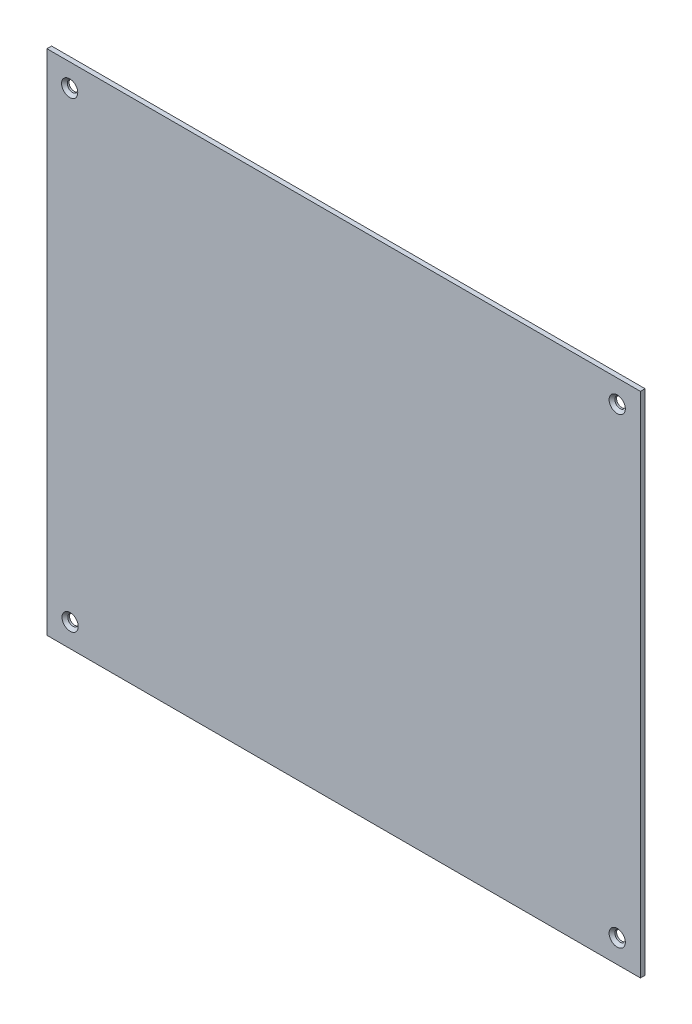
ISO-10303-21;
HEADER;
FILE_DESCRIPTION(('STEP AP214'),'2;1');
FILE_NAME('part.step','',(''),(''),'','','');
FILE_SCHEMA(('AUTOMOTIVE_DESIGN { 1 0 10303 214 1 1 1 1 }'));
ENDSEC;
DATA;
#1=APPLICATION_CONTEXT('core data for automotive mechanical design processes');
#2=APPLICATION_PROTOCOL_DEFINITION('international standard','automotive_design',2000,#1);
#3=PRODUCT_CONTEXT('',#1,'mechanical');
#4=PRODUCT('Part','Part','',(#3));
#5=PRODUCT_RELATED_PRODUCT_CATEGORY('part','',(#4));
#6=PRODUCT_DEFINITION_FORMATION('','',#4);
#7=PRODUCT_DEFINITION_CONTEXT('part definition',#1,'design');
#8=PRODUCT_DEFINITION('design','',#6,#7);
#9=PRODUCT_DEFINITION_SHAPE('','',#8);
#10=(LENGTH_UNIT() NAMED_UNIT(*) SI_UNIT(.MILLI.,.METRE.));
#11=(NAMED_UNIT(*) PLANE_ANGLE_UNIT() SI_UNIT($,.RADIAN.));
#12=(NAMED_UNIT(*) SI_UNIT($,.STERADIAN.) SOLID_ANGLE_UNIT());
#13=UNCERTAINTY_MEASURE_WITH_UNIT(LENGTH_MEASURE(1.E-05),#10,'distance_accuracy_value','');
#14=(GEOMETRIC_REPRESENTATION_CONTEXT(3) GLOBAL_UNCERTAINTY_ASSIGNED_CONTEXT((#13)) GLOBAL_UNIT_ASSIGNED_CONTEXT((#10,
#11,#12)) REPRESENTATION_CONTEXT('',''));
#15=CARTESIAN_POINT('',(0.,0.,0.));
#16=DIRECTION('',(0.,0.,1.));
#17=DIRECTION('',(1.,0.,0.));
#18=AXIS2_PLACEMENT_3D('',#15,#16,#17);
#19=CARTESIAN_POINT('',(0.,0.,1.905));
#20=DIRECTION('',(0.,0.,-1.));
#21=DIRECTION('',(-1.,0.,0.));
#22=AXIS2_PLACEMENT_3D('',#19,#20,#21);
#23=PLANE('',#22);
#24=CARTESIAN_POINT('',(233.807,9.525,1.905));
#25=DIRECTION('',(0.,0.,1.));
#26=DIRECTION('',(1.,0.,0.));
#27=AXIS2_PLACEMENT_3D('',#24,#25,#26);
#28=CIRCLE('',#27,3.32740000000001);
#29=CARTESIAN_POINT('',(237.1344,9.525,1.905));
#30=VERTEX_POINT('',#29);
#31=EDGE_CURVE('E139',#30,#30,#28,.T.);
#32=ORIENTED_EDGE('',*,*,#31,.F.);
#33=EDGE_LOOP('',(#32));
#34=FACE_BOUND('',#33,.T.);
#35=CARTESIAN_POINT('',(233.807,198.955000999999,1.905));
#36=DIRECTION('',(0.,0.,1.));
#37=DIRECTION('',(1.,0.,0.));
#38=AXIS2_PLACEMENT_3D('',#35,#36,#37);
#39=CIRCLE('',#38,3.32740000000001);
#40=CARTESIAN_POINT('',(237.1344,198.955000999999,1.905));
#41=VERTEX_POINT('',#40);
#42=EDGE_CURVE('E121',#41,#41,#39,.T.);
#43=ORIENTED_EDGE('',*,*,#42,.F.);
#44=EDGE_LOOP('',(#43));
#45=FACE_BOUND('',#44,.T.);
#46=DIRECTION('',(0.,-1.,0.));
#47=VECTOR('',#46,1.);
#48=CARTESIAN_POINT('',(0.,0.,1.905));
#49=LINE('',#48,#47);
#50=CARTESIAN_POINT('',(0.,208.28,1.905));
#51=VERTEX_POINT('',#50);
#52=CARTESIAN_POINT('',(0.,0.,1.905));
#53=VERTEX_POINT('',#52);
#54=EDGE_CURVE('E90',#51,#53,#49,.T.);
#55=ORIENTED_EDGE('',*,*,#54,.T.);
#56=DIRECTION('',(1.,0.,0.));
#57=VECTOR('',#56,1.);
#58=CARTESIAN_POINT('',(0.,0.,1.905));
#59=LINE('',#58,#57);
#60=CARTESIAN_POINT('',(243.332,0.,1.905));
#61=VERTEX_POINT('',#60);
#62=EDGE_CURVE('E85',#53,#61,#59,.T.);
#63=ORIENTED_EDGE('',*,*,#62,.T.);
#64=DIRECTION('',(0.,1.,0.));
#65=VECTOR('',#64,1.);
#66=CARTESIAN_POINT('',(243.332,0.,1.905));
#67=LINE('',#66,#65);
#68=CARTESIAN_POINT('',(243.332,208.28,1.905));
#69=VERTEX_POINT('',#68);
#70=EDGE_CURVE('E88',#61,#69,#67,.T.);
#71=ORIENTED_EDGE('',*,*,#70,.T.);
#72=DIRECTION('',(-1.,0.,0.));
#73=VECTOR('',#72,1.);
#74=CARTESIAN_POINT('',(0.,208.28,1.905));
#75=LINE('',#74,#73);
#76=EDGE_CURVE('E55',#69,#51,#75,.T.);
#77=ORIENTED_EDGE('',*,*,#76,.T.);
#78=EDGE_LOOP('',(#55,#63,#71,#77));
#79=FACE_BOUND('',#78,.T.);
#80=CARTESIAN_POINT('',(9.525,9.525,1.905));
#81=DIRECTION('',(0.,0.,1.));
#82=DIRECTION('',(1.,0.,0.));
#83=AXIS2_PLACEMENT_3D('',#80,#81,#82);
#84=CIRCLE('',#83,3.3274);
#85=CARTESIAN_POINT('',(12.8524,9.525,1.905));
#86=VERTEX_POINT('',#85);
#87=EDGE_CURVE('E130',#86,#86,#84,.T.);
#88=ORIENTED_EDGE('',*,*,#87,.F.);
#89=EDGE_LOOP('',(#88));
#90=FACE_BOUND('',#89,.T.);
#91=CARTESIAN_POINT('',(9.32499900000117,198.955000999999,1.905));
#92=DIRECTION('',(0.,0.,1.));
#93=DIRECTION('',(1.,0.,0.));
#94=AXIS2_PLACEMENT_3D('',#91,#92,#93);
#95=CIRCLE('',#94,3.3274);
#96=CARTESIAN_POINT('',(12.6523990000012,198.955000999999,1.905));
#97=VERTEX_POINT('',#96);
#98=EDGE_CURVE('E148',#97,#97,#95,.T.);
#99=ORIENTED_EDGE('',*,*,#98,.F.);
#100=EDGE_LOOP('',(#99));
#101=FACE_BOUND('',#100,.T.);
#102=ADVANCED_FACE('F38',(#34,#45,#79,#90,#101),#23,.F.);
#103=CARTESIAN_POINT('',(0.,0.,1.905));
#104=DIRECTION('',(1.,0.,0.));
#105=DIRECTION('',(0.,0.,-1.));
#106=AXIS2_PLACEMENT_3D('',#103,#104,#105);
#107=PLANE('',#106);
#108=DIRECTION('',(0.,-1.,0.));
#109=VECTOR('',#108,1.);
#110=CARTESIAN_POINT('',(0.,0.,0.));
#111=LINE('',#110,#109);
#112=CARTESIAN_POINT('',(0.,208.28,0.));
#113=VERTEX_POINT('',#112);
#114=CARTESIAN_POINT('',(0.,0.,0.));
#115=VERTEX_POINT('',#114);
#116=EDGE_CURVE('E102',#113,#115,#111,.T.);
#117=ORIENTED_EDGE('',*,*,#116,.T.);
#118=DIRECTION('',(0.,0.,-1.));
#119=VECTOR('',#118,1.);
#120=CARTESIAN_POINT('',(0.,0.,1.905));
#121=LINE('',#120,#119);
#122=EDGE_CURVE('E11',#53,#115,#121,.T.);
#123=ORIENTED_EDGE('',*,*,#122,.F.);
#124=ORIENTED_EDGE('',*,*,#54,.F.);
#125=DIRECTION('',(0.,0.,-1.));
#126=VECTOR('',#125,1.);
#127=CARTESIAN_POINT('',(0.,208.28,1.905));
#128=LINE('',#127,#126);
#129=EDGE_CURVE('E98',#51,#113,#128,.T.);
#130=ORIENTED_EDGE('',*,*,#129,.T.);
#131=EDGE_LOOP('',(#117,#123,#124,#130));
#132=FACE_BOUND('',#131,.T.);
#133=ADVANCED_FACE('F40',(#132),#107,.F.);
#134=CARTESIAN_POINT('',(0.,0.,1.905));
#135=DIRECTION('',(0.,1.,0.));
#136=DIRECTION('',(0.,0.,1.));
#137=AXIS2_PLACEMENT_3D('',#134,#135,#136);
#138=PLANE('',#137);
#139=DIRECTION('',(1.,0.,0.));
#140=VECTOR('',#139,1.);
#141=CARTESIAN_POINT('',(0.,0.,0.));
#142=LINE('',#141,#140);
#143=CARTESIAN_POINT('',(243.332,0.,0.));
#144=VERTEX_POINT('',#143);
#145=EDGE_CURVE('E94',#115,#144,#142,.T.);
#146=ORIENTED_EDGE('',*,*,#145,.T.);
#147=DIRECTION('',(0.,0.,-1.));
#148=VECTOR('',#147,1.);
#149=CARTESIAN_POINT('',(243.332,0.,1.905));
#150=LINE('',#149,#148);
#151=EDGE_CURVE('E47',#61,#144,#150,.T.);
#152=ORIENTED_EDGE('',*,*,#151,.F.);
#153=ORIENTED_EDGE('',*,*,#62,.F.);
#154=ORIENTED_EDGE('',*,*,#122,.T.);
#155=EDGE_LOOP('',(#146,#152,#153,#154));
#156=FACE_BOUND('',#155,.T.);
#157=ADVANCED_FACE('F93',(#156),#138,.F.);
#158=CARTESIAN_POINT('',(243.332,0.,1.905));
#159=DIRECTION('',(-1.,0.,0.));
#160=DIRECTION('',(0.,0.,1.));
#161=AXIS2_PLACEMENT_3D('',#158,#159,#160);
#162=PLANE('',#161);
#163=DIRECTION('',(0.,1.,0.));
#164=VECTOR('',#163,1.);
#165=CARTESIAN_POINT('',(243.332,0.,0.));
#166=LINE('',#165,#164);
#167=CARTESIAN_POINT('',(243.332,208.28,0.));
#168=VERTEX_POINT('',#167);
#169=EDGE_CURVE('E72',#144,#168,#166,.T.);
#170=ORIENTED_EDGE('',*,*,#169,.T.);
#171=DIRECTION('',(0.,0.,-1.));
#172=VECTOR('',#171,1.);
#173=CARTESIAN_POINT('',(243.332,208.28,1.905));
#174=LINE('',#173,#172);
#175=EDGE_CURVE('E95',#69,#168,#174,.T.);
#176=ORIENTED_EDGE('',*,*,#175,.F.);
#177=ORIENTED_EDGE('',*,*,#70,.F.);
#178=ORIENTED_EDGE('',*,*,#151,.T.);
#179=EDGE_LOOP('',(#170,#176,#177,#178));
#180=FACE_BOUND('',#179,.T.);
#181=ADVANCED_FACE('F96',(#180),#162,.F.);
#182=CARTESIAN_POINT('',(0.,208.28,1.905));
#183=DIRECTION('',(0.,-1.,0.));
#184=DIRECTION('',(0.,0.,-1.));
#185=AXIS2_PLACEMENT_3D('',#182,#183,#184);
#186=PLANE('',#185);
#187=DIRECTION('',(-1.,0.,0.));
#188=VECTOR('',#187,1.);
#189=CARTESIAN_POINT('',(0.,208.28,0.));
#190=LINE('',#189,#188);
#191=EDGE_CURVE('E78',#168,#113,#190,.T.);
#192=ORIENTED_EDGE('',*,*,#191,.T.);
#193=ORIENTED_EDGE('',*,*,#129,.F.);
#194=ORIENTED_EDGE('',*,*,#76,.F.);
#195=ORIENTED_EDGE('',*,*,#175,.T.);
#196=EDGE_LOOP('',(#192,#193,#194,#195));
#197=FACE_BOUND('',#196,.T.);
#198=ADVANCED_FACE('F110',(#197),#186,.F.);
#199=CARTESIAN_POINT('',(0.,0.,0.));
#200=DIRECTION('',(0.,0.,-1.));
#201=DIRECTION('',(-1.,0.,0.));
#202=AXIS2_PLACEMENT_3D('',#199,#200,#201);
#203=PLANE('',#202);
#204=CARTESIAN_POINT('',(9.32499900000117,198.955000999999,0.));
#205=DIRECTION('',(0.,0.,-1.));
#206=DIRECTION('',(-1.,0.,0.));
#207=AXIS2_PLACEMENT_3D('',#204,#205,#206);
#208=CIRCLE('',#207,2.15265);
#209=CARTESIAN_POINT('',(7.17234900000117,198.955000999999,0.));
#210=VERTEX_POINT('',#209);
#211=EDGE_CURVE('E142',#210,#210,#208,.T.);
#212=ORIENTED_EDGE('',*,*,#211,.F.);
#213=EDGE_LOOP('',(#212));
#214=FACE_BOUND('',#213,.T.);
#215=CARTESIAN_POINT('',(233.807,9.525,0.));
#216=DIRECTION('',(0.,0.,-1.));
#217=DIRECTION('',(-1.,0.,0.));
#218=AXIS2_PLACEMENT_3D('',#215,#216,#217);
#219=CIRCLE('',#218,2.15265000000001);
#220=CARTESIAN_POINT('',(231.65435,9.525,0.));
#221=VERTEX_POINT('',#220);
#222=EDGE_CURVE('E133',#221,#221,#219,.T.);
#223=ORIENTED_EDGE('',*,*,#222,.F.);
#224=EDGE_LOOP('',(#223));
#225=FACE_BOUND('',#224,.T.);
#226=CARTESIAN_POINT('',(9.525,9.525,0.));
#227=DIRECTION('',(0.,0.,-1.));
#228=DIRECTION('',(-1.,0.,0.));
#229=AXIS2_PLACEMENT_3D('',#226,#227,#228);
#230=CIRCLE('',#229,2.15265);
#231=CARTESIAN_POINT('',(7.37235,9.525,0.));
#232=VERTEX_POINT('',#231);
#233=EDGE_CURVE('E124',#232,#232,#230,.T.);
#234=ORIENTED_EDGE('',*,*,#233,.F.);
#235=EDGE_LOOP('',(#234));
#236=FACE_BOUND('',#235,.T.);
#237=CARTESIAN_POINT('',(233.807,198.955000999999,0.));
#238=DIRECTION('',(0.,0.,-1.));
#239=DIRECTION('',(-1.,0.,0.));
#240=AXIS2_PLACEMENT_3D('',#237,#238,#239);
#241=CIRCLE('',#240,2.15265000000001);
#242=CARTESIAN_POINT('',(231.65435,198.955000999999,0.));
#243=VERTEX_POINT('',#242);
#244=EDGE_CURVE('E105',#243,#243,#241,.T.);
#245=ORIENTED_EDGE('',*,*,#244,.F.);
#246=EDGE_LOOP('',(#245));
#247=FACE_BOUND('',#246,.T.);
#248=ORIENTED_EDGE('',*,*,#116,.F.);
#249=ORIENTED_EDGE('',*,*,#191,.F.);
#250=ORIENTED_EDGE('',*,*,#169,.F.);
#251=ORIENTED_EDGE('',*,*,#145,.F.);
#252=EDGE_LOOP('',(#248,#249,#250,#251));
#253=FACE_BOUND('',#252,.T.);
#254=ADVANCED_FACE('F113',(#214,#225,#236,#247,#253),#203,.T.);
#255=CARTESIAN_POINT('',(233.807,198.955000999999,1.905));
#256=DIRECTION('',(0.,0.,1.));
#257=DIRECTION('',(1.,0.,0.));
#258=AXIS2_PLACEMENT_3D('',#255,#256,#257);
#259=CYLINDRICAL_SURFACE('',#258,2.15265000000001);
#260=CARTESIAN_POINT('',(233.807,198.955000999999,0.73025));
#261=DIRECTION('',(0.,0.,1.));
#262=DIRECTION('',(1.,0.,0.));
#263=AXIS2_PLACEMENT_3D('',#260,#261,#262);
#264=CIRCLE('',#263,2.15265000000001);
#265=CARTESIAN_POINT('',(235.95965,198.955000999999,0.73025));
#266=VERTEX_POINT('',#265);
#267=EDGE_CURVE('E118',#266,#266,#264,.T.);
#268=ORIENTED_EDGE('',*,*,#267,.T.);
#269=EDGE_LOOP('',(#268));
#270=FACE_BOUND('',#269,.T.);
#271=ORIENTED_EDGE('',*,*,#244,.T.);
#272=EDGE_LOOP('',(#271));
#273=FACE_BOUND('',#272,.T.);
#274=ADVANCED_FACE('F166',(#270,#273),#259,.F.);
#275=CARTESIAN_POINT('',(233.807,198.955000999999,1.905));
#276=DIRECTION('',(0.,0.,1.));
#277=DIRECTION('',(1.,0.,0.));
#278=AXIS2_PLACEMENT_3D('',#275,#276,#277);
#279=CONICAL_SURFACE('',#278,3.32740000000001,0.785398163397449);
#280=ORIENTED_EDGE('',*,*,#267,.F.);
#281=EDGE_LOOP('',(#280));
#282=FACE_BOUND('',#281,.T.);
#283=ORIENTED_EDGE('',*,*,#42,.T.);
#284=EDGE_LOOP('',(#283));
#285=FACE_BOUND('',#284,.T.);
#286=ADVANCED_FACE('F207',(#282,#285),#279,.F.);
#287=CARTESIAN_POINT('',(9.525,9.525,1.905));
#288=DIRECTION('',(0.,0.,1.));
#289=DIRECTION('',(1.,0.,0.));
#290=AXIS2_PLACEMENT_3D('',#287,#288,#289);
#291=CYLINDRICAL_SURFACE('',#290,2.15265);
#292=CARTESIAN_POINT('',(9.525,9.525,0.73025));
#293=DIRECTION('',(0.,0.,1.));
#294=DIRECTION('',(1.,0.,0.));
#295=AXIS2_PLACEMENT_3D('',#292,#293,#294);
#296=CIRCLE('',#295,2.15265);
#297=CARTESIAN_POINT('',(11.67765,9.525,0.73025));
#298=VERTEX_POINT('',#297);
#299=EDGE_CURVE('E127',#298,#298,#296,.T.);
#300=ORIENTED_EDGE('',*,*,#299,.T.);
#301=EDGE_LOOP('',(#300));
#302=FACE_BOUND('',#301,.T.);
#303=ORIENTED_EDGE('',*,*,#233,.T.);
#304=EDGE_LOOP('',(#303));
#305=FACE_BOUND('',#304,.T.);
#306=ADVANCED_FACE('F216',(#302,#305),#291,.F.);
#307=CARTESIAN_POINT('',(9.525,9.525,1.905));
#308=DIRECTION('',(0.,0.,1.));
#309=DIRECTION('',(1.,0.,0.));
#310=AXIS2_PLACEMENT_3D('',#307,#308,#309);
#311=CONICAL_SURFACE('',#310,3.3274,0.785398163397448);
#312=ORIENTED_EDGE('',*,*,#299,.F.);
#313=EDGE_LOOP('',(#312));
#314=FACE_BOUND('',#313,.T.);
#315=ORIENTED_EDGE('',*,*,#87,.T.);
#316=EDGE_LOOP('',(#315));
#317=FACE_BOUND('',#316,.T.);
#318=ADVANCED_FACE('F225',(#314,#317),#311,.F.);
#319=CARTESIAN_POINT('',(233.807,9.525,1.905));
#320=DIRECTION('',(0.,0.,1.));
#321=DIRECTION('',(1.,0.,0.));
#322=AXIS2_PLACEMENT_3D('',#319,#320,#321);
#323=CYLINDRICAL_SURFACE('',#322,2.15265000000001);
#324=CARTESIAN_POINT('',(233.807,9.525,0.73025));
#325=DIRECTION('',(0.,0.,1.));
#326=DIRECTION('',(1.,0.,0.));
#327=AXIS2_PLACEMENT_3D('',#324,#325,#326);
#328=CIRCLE('',#327,2.15265000000001);
#329=CARTESIAN_POINT('',(235.95965,9.525,0.73025));
#330=VERTEX_POINT('',#329);
#331=EDGE_CURVE('E136',#330,#330,#328,.T.);
#332=ORIENTED_EDGE('',*,*,#331,.T.);
#333=EDGE_LOOP('',(#332));
#334=FACE_BOUND('',#333,.T.);
#335=ORIENTED_EDGE('',*,*,#222,.T.);
#336=EDGE_LOOP('',(#335));
#337=FACE_BOUND('',#336,.T.);
#338=ADVANCED_FACE('F235',(#334,#337),#323,.F.);
#339=CARTESIAN_POINT('',(233.807,9.525,1.905));
#340=DIRECTION('',(0.,0.,1.));
#341=DIRECTION('',(1.,0.,0.));
#342=AXIS2_PLACEMENT_3D('',#339,#340,#341);
#343=CONICAL_SURFACE('',#342,3.32740000000001,0.785398163397449);
#344=ORIENTED_EDGE('',*,*,#331,.F.);
#345=EDGE_LOOP('',(#344));
#346=FACE_BOUND('',#345,.T.);
#347=ORIENTED_EDGE('',*,*,#31,.T.);
#348=EDGE_LOOP('',(#347));
#349=FACE_BOUND('',#348,.T.);
#350=ADVANCED_FACE('F245',(#346,#349),#343,.F.);
#351=CARTESIAN_POINT('',(9.32499900000117,198.955000999999,1.905));
#352=DIRECTION('',(0.,0.,1.));
#353=DIRECTION('',(1.,0.,0.));
#354=AXIS2_PLACEMENT_3D('',#351,#352,#353);
#355=CYLINDRICAL_SURFACE('',#354,2.15265);
#356=CARTESIAN_POINT('',(9.32499900000117,198.955000999999,0.73025));
#357=DIRECTION('',(0.,0.,1.));
#358=DIRECTION('',(1.,0.,0.));
#359=AXIS2_PLACEMENT_3D('',#356,#357,#358);
#360=CIRCLE('',#359,2.15265);
#361=CARTESIAN_POINT('',(11.4776490000012,198.955000999999,0.73025));
#362=VERTEX_POINT('',#361);
#363=EDGE_CURVE('E145',#362,#362,#360,.T.);
#364=ORIENTED_EDGE('',*,*,#363,.T.);
#365=EDGE_LOOP('',(#364));
#366=FACE_BOUND('',#365,.T.);
#367=ORIENTED_EDGE('',*,*,#211,.T.);
#368=EDGE_LOOP('',(#367));
#369=FACE_BOUND('',#368,.T.);
#370=ADVANCED_FACE('F255',(#366,#369),#355,.F.);
#371=CARTESIAN_POINT('',(9.32499900000117,198.955000999999,1.905));
#372=DIRECTION('',(0.,0.,1.));
#373=DIRECTION('',(1.,0.,0.));
#374=AXIS2_PLACEMENT_3D('',#371,#372,#373);
#375=CONICAL_SURFACE('',#374,3.3274,0.785398163397448);
#376=ORIENTED_EDGE('',*,*,#363,.F.);
#377=EDGE_LOOP('',(#376));
#378=FACE_BOUND('',#377,.T.);
#379=ORIENTED_EDGE('',*,*,#98,.T.);
#380=EDGE_LOOP('',(#379));
#381=FACE_BOUND('',#380,.T.);
#382=ADVANCED_FACE('F152',(#378,#381),#375,.F.);
#383=CLOSED_SHELL('',(#102,#133,#157,#181,#198,#254,#274,#286,#306,#318,#338,#350,#370,#382));
#384=MANIFOLD_SOLID_BREP('B2',#383);
#385=ADVANCED_BREP_SHAPE_REPRESENTATION('',(#18,#384),#14);
#386=SHAPE_DEFINITION_REPRESENTATION(#9,#385);
ENDSEC;
END-ISO-10303-21;
